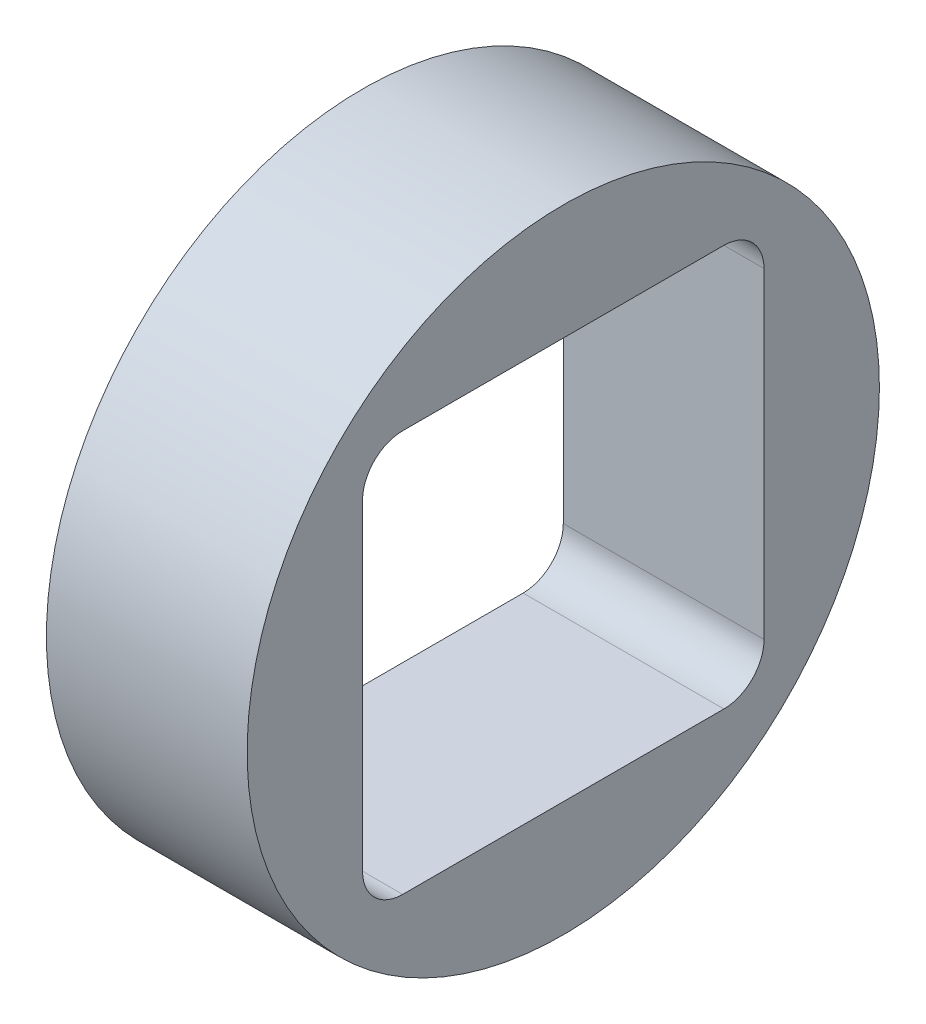
ISO-10303-21;
HEADER;
FILE_DESCRIPTION(('STEP AP214'),'2;1');
FILE_NAME('part.step','',(''),(''),'','','');
FILE_SCHEMA(('AUTOMOTIVE_DESIGN { 1 0 10303 214 1 1 1 1 }'));
ENDSEC;
DATA;
#1=APPLICATION_CONTEXT('core data for automotive mechanical design processes');
#2=APPLICATION_PROTOCOL_DEFINITION('international standard','automotive_design',2000,#1);
#3=PRODUCT_CONTEXT('',#1,'mechanical');
#4=PRODUCT('Part','Part','',(#3));
#5=PRODUCT_RELATED_PRODUCT_CATEGORY('part','',(#4));
#6=PRODUCT_DEFINITION_FORMATION('','',#4);
#7=PRODUCT_DEFINITION_CONTEXT('part definition',#1,'design');
#8=PRODUCT_DEFINITION('design','',#6,#7);
#9=PRODUCT_DEFINITION_SHAPE('','',#8);
#10=(LENGTH_UNIT() NAMED_UNIT(*) SI_UNIT(.MILLI.,.METRE.));
#11=(NAMED_UNIT(*) PLANE_ANGLE_UNIT() SI_UNIT($,.RADIAN.));
#12=(NAMED_UNIT(*) SI_UNIT($,.STERADIAN.) SOLID_ANGLE_UNIT());
#13=UNCERTAINTY_MEASURE_WITH_UNIT(LENGTH_MEASURE(1.E-05),#10,'distance_accuracy_value','');
#14=(GEOMETRIC_REPRESENTATION_CONTEXT(3) GLOBAL_UNCERTAINTY_ASSIGNED_CONTEXT((#13)) GLOBAL_UNIT_ASSIGNED_CONTEXT((#10,
#11,#12)) REPRESENTATION_CONTEXT('',''));
#15=CARTESIAN_POINT('',(0.,0.,0.));
#16=DIRECTION('',(0.,0.,1.));
#17=DIRECTION('',(1.,0.,0.));
#18=AXIS2_PLACEMENT_3D('',#15,#16,#17);
#19=CARTESIAN_POINT('',(3.175,0.,0.));
#20=DIRECTION('',(-1.,0.,0.));
#21=DIRECTION('',(0.,0.,1.));
#22=AXIS2_PLACEMENT_3D('',#19,#20,#21);
#23=CYLINDRICAL_SURFACE('',#22,5.);
#24=CARTESIAN_POINT('',(3.175,0.,0.));
#25=DIRECTION('',(1.,0.,0.));
#26=DIRECTION('',(0.,0.,-1.));
#27=AXIS2_PLACEMENT_3D('',#24,#25,#26);
#28=CIRCLE('',#27,5.);
#29=CARTESIAN_POINT('',(3.175,0.,-5.));
#30=VERTEX_POINT('',#29);
#31=EDGE_CURVE('E154',#30,#30,#28,.T.);
#32=ORIENTED_EDGE('',*,*,#31,.F.);
#33=EDGE_LOOP('',(#32));
#34=FACE_BOUND('',#33,.T.);
#35=CARTESIAN_POINT('',(0.,0.,0.));
#36=DIRECTION('',(1.,0.,0.));
#37=DIRECTION('',(0.,0.,-1.));
#38=AXIS2_PLACEMENT_3D('',#35,#36,#37);
#39=CIRCLE('',#38,5.);
#40=CARTESIAN_POINT('',(0.,0.,-5.));
#41=VERTEX_POINT('',#40);
#42=EDGE_CURVE('E157',#41,#41,#39,.T.);
#43=ORIENTED_EDGE('',*,*,#42,.T.);
#44=EDGE_LOOP('',(#43));
#45=FACE_BOUND('',#44,.T.);
#46=ADVANCED_FACE('F47',(#34,#45),#23,.T.);
#47=CARTESIAN_POINT('',(3.175,0.,0.));
#48=DIRECTION('',(1.,0.,0.));
#49=DIRECTION('',(0.,0.,-1.));
#50=AXIS2_PLACEMENT_3D('',#47,#48,#49);
#51=PLANE('',#50);
#52=DIRECTION('',(0.,1.,0.));
#53=VECTOR('',#52,1.);
#54=CARTESIAN_POINT('',(3.175,-3.175,-3.175));
#55=LINE('',#54,#53);
#56=CARTESIAN_POINT('',(3.175,-2.54,-3.175));
#57=VERTEX_POINT('',#56);
#58=CARTESIAN_POINT('',(3.175,2.54,-3.175));
#59=VERTEX_POINT('',#58);
#60=EDGE_CURVE('E147',#57,#59,#55,.T.);
#61=ORIENTED_EDGE('',*,*,#60,.F.);
#62=CARTESIAN_POINT('',(3.175,-2.54,-2.54));
#63=DIRECTION('',(1.,0.,0.));
#64=DIRECTION('',(0.,0.,-1.));
#65=AXIS2_PLACEMENT_3D('',#62,#63,#64);
#66=CIRCLE('',#65,0.635);
#67=CARTESIAN_POINT('',(3.175,-3.175,-2.54));
#68=VERTEX_POINT('',#67);
#69=EDGE_CURVE('E123',#57,#68,#66,.F.);
#70=ORIENTED_EDGE('',*,*,#69,.T.);
#71=DIRECTION('',(0.,0.,1.));
#72=VECTOR('',#71,1.);
#73=CARTESIAN_POINT('',(3.175,-3.175,-3.175));
#74=LINE('',#73,#72);
#75=CARTESIAN_POINT('',(3.175,-3.175,2.54));
#76=VERTEX_POINT('',#75);
#77=EDGE_CURVE('E133',#68,#76,#74,.T.);
#78=ORIENTED_EDGE('',*,*,#77,.T.);
#79=CARTESIAN_POINT('',(3.175,-2.54,2.54));
#80=DIRECTION('',(1.,0.,0.));
#81=DIRECTION('',(0.,0.,-1.));
#82=AXIS2_PLACEMENT_3D('',#79,#80,#81);
#83=CIRCLE('',#82,0.635);
#84=CARTESIAN_POINT('',(3.175,-2.54,3.175));
#85=VERTEX_POINT('',#84);
#86=EDGE_CURVE('E174',#76,#85,#83,.F.);
#87=ORIENTED_EDGE('',*,*,#86,.T.);
#88=DIRECTION('',(0.,1.,0.));
#89=VECTOR('',#88,1.);
#90=CARTESIAN_POINT('',(3.175,-3.175,3.175));
#91=LINE('',#90,#89);
#92=CARTESIAN_POINT('',(3.175,2.54,3.175));
#93=VERTEX_POINT('',#92);
#94=EDGE_CURVE('E190',#85,#93,#91,.T.);
#95=ORIENTED_EDGE('',*,*,#94,.T.);
#96=CARTESIAN_POINT('',(3.175,2.54,2.54));
#97=DIRECTION('',(1.,0.,0.));
#98=DIRECTION('',(0.,0.,-1.));
#99=AXIS2_PLACEMENT_3D('',#96,#97,#98);
#100=CIRCLE('',#99,0.635);
#101=CARTESIAN_POINT('',(3.175,3.175,2.54));
#102=VERTEX_POINT('',#101);
#103=EDGE_CURVE('E62',#93,#102,#100,.F.);
#104=ORIENTED_EDGE('',*,*,#103,.T.);
#105=DIRECTION('',(0.,0.,1.));
#106=VECTOR('',#105,1.);
#107=CARTESIAN_POINT('',(3.175,3.175,-3.175));
#108=LINE('',#107,#106);
#109=CARTESIAN_POINT('',(3.175,3.175,-2.54));
#110=VERTEX_POINT('',#109);
#111=EDGE_CURVE('E187',#110,#102,#108,.T.);
#112=ORIENTED_EDGE('',*,*,#111,.F.);
#113=CARTESIAN_POINT('',(3.175,2.54,-2.54));
#114=DIRECTION('',(1.,0.,0.));
#115=DIRECTION('',(0.,0.,-1.));
#116=AXIS2_PLACEMENT_3D('',#113,#114,#115);
#117=CIRCLE('',#116,0.635);
#118=EDGE_CURVE('E12',#110,#59,#117,.F.);
#119=ORIENTED_EDGE('',*,*,#118,.T.);
#120=EDGE_LOOP('',(#61,#70,#78,#87,#95,#104,#112,#119));
#121=FACE_BOUND('',#120,.T.);
#122=ORIENTED_EDGE('',*,*,#31,.T.);
#123=EDGE_LOOP('',(#122));
#124=FACE_BOUND('',#123,.T.);
#125=ADVANCED_FACE('F185',(#121,#124),#51,.T.);
#126=CARTESIAN_POINT('',(0.,0.,0.));
#127=DIRECTION('',(1.,0.,0.));
#128=DIRECTION('',(0.,0.,-1.));
#129=AXIS2_PLACEMENT_3D('',#126,#127,#128);
#130=PLANE('',#129);
#131=DIRECTION('',(0.,1.,0.));
#132=VECTOR('',#131,1.);
#133=CARTESIAN_POINT('',(0.,-3.175,3.175));
#134=LINE('',#133,#132);
#135=CARTESIAN_POINT('',(0.,-2.54,3.175));
#136=VERTEX_POINT('',#135);
#137=CARTESIAN_POINT('',(0.,2.54,3.175));
#138=VERTEX_POINT('',#137);
#139=EDGE_CURVE('E141',#136,#138,#134,.T.);
#140=ORIENTED_EDGE('',*,*,#139,.F.);
#141=CARTESIAN_POINT('',(0.,-2.54,2.54));
#142=DIRECTION('',(1.,0.,0.));
#143=DIRECTION('',(0.,0.,-1.));
#144=AXIS2_PLACEMENT_3D('',#141,#142,#143);
#145=CIRCLE('',#144,0.635);
#146=CARTESIAN_POINT('',(0.,-3.175,2.54));
#147=VERTEX_POINT('',#146);
#148=EDGE_CURVE('E140',#136,#147,#145,.T.);
#149=ORIENTED_EDGE('',*,*,#148,.T.);
#150=DIRECTION('',(0.,0.,1.));
#151=VECTOR('',#150,1.);
#152=CARTESIAN_POINT('',(0.,-3.175,-3.175));
#153=LINE('',#152,#151);
#154=CARTESIAN_POINT('',(0.,-3.175,-2.54));
#155=VERTEX_POINT('',#154);
#156=EDGE_CURVE('E130',#155,#147,#153,.T.);
#157=ORIENTED_EDGE('',*,*,#156,.F.);
#158=CARTESIAN_POINT('',(0.,-2.54,-2.54));
#159=DIRECTION('',(1.,0.,0.));
#160=DIRECTION('',(0.,0.,-1.));
#161=AXIS2_PLACEMENT_3D('',#158,#159,#160);
#162=CIRCLE('',#161,0.635);
#163=CARTESIAN_POINT('',(0.,-2.54,-3.175));
#164=VERTEX_POINT('',#163);
#165=EDGE_CURVE('E113',#155,#164,#162,.T.);
#166=ORIENTED_EDGE('',*,*,#165,.T.);
#167=DIRECTION('',(0.,1.,0.));
#168=VECTOR('',#167,1.);
#169=CARTESIAN_POINT('',(0.,-3.175,-3.175));
#170=LINE('',#169,#168);
#171=CARTESIAN_POINT('',(0.,2.54,-3.175));
#172=VERTEX_POINT('',#171);
#173=EDGE_CURVE('E152',#164,#172,#170,.T.);
#174=ORIENTED_EDGE('',*,*,#173,.T.);
#175=CARTESIAN_POINT('',(0.,2.54,-2.54));
#176=DIRECTION('',(1.,0.,0.));
#177=DIRECTION('',(0.,0.,-1.));
#178=AXIS2_PLACEMENT_3D('',#175,#176,#177);
#179=CIRCLE('',#178,0.635);
#180=CARTESIAN_POINT('',(0.,3.175,-2.54));
#181=VERTEX_POINT('',#180);
#182=EDGE_CURVE('E55',#172,#181,#179,.T.);
#183=ORIENTED_EDGE('',*,*,#182,.T.);
#184=DIRECTION('',(0.,0.,1.));
#185=VECTOR('',#184,1.);
#186=CARTESIAN_POINT('',(0.,3.175,-3.175));
#187=LINE('',#186,#185);
#188=CARTESIAN_POINT('',(0.,3.175,2.54));
#189=VERTEX_POINT('',#188);
#190=EDGE_CURVE('E144',#181,#189,#187,.T.);
#191=ORIENTED_EDGE('',*,*,#190,.T.);
#192=CARTESIAN_POINT('',(0.,2.54,2.54));
#193=DIRECTION('',(1.,0.,0.));
#194=DIRECTION('',(0.,0.,-1.));
#195=AXIS2_PLACEMENT_3D('',#192,#193,#194);
#196=CIRCLE('',#195,0.635);
#197=EDGE_CURVE('E176',#189,#138,#196,.T.);
#198=ORIENTED_EDGE('',*,*,#197,.T.);
#199=EDGE_LOOP('',(#140,#149,#157,#166,#174,#183,#191,#198));
#200=FACE_BOUND('',#199,.T.);
#201=ORIENTED_EDGE('',*,*,#42,.F.);
#202=EDGE_LOOP('',(#201));
#203=FACE_BOUND('',#202,.T.);
#204=ADVANCED_FACE('F138',(#200,#203),#130,.F.);
#205=CARTESIAN_POINT('',(3.175,-3.175,-3.175));
#206=DIRECTION('',(0.,-1.,0.));
#207=DIRECTION('',(0.,0.,-1.));
#208=AXIS2_PLACEMENT_3D('',#205,#206,#207);
#209=PLANE('',#208);
#210=ORIENTED_EDGE('',*,*,#77,.F.);
#211=DIRECTION('',(-1.,0.,0.));
#212=VECTOR('',#211,1.);
#213=CARTESIAN_POINT('',(3.175,-3.175,-2.54));
#214=LINE('',#213,#212);
#215=EDGE_CURVE('E117',#68,#155,#214,.T.);
#216=ORIENTED_EDGE('',*,*,#215,.T.);
#217=ORIENTED_EDGE('',*,*,#156,.T.);
#218=DIRECTION('',(-1.,0.,0.));
#219=VECTOR('',#218,1.);
#220=CARTESIAN_POINT('',(3.175,-3.175,2.54));
#221=LINE('',#220,#219);
#222=EDGE_CURVE('E135',#147,#76,#221,.F.);
#223=ORIENTED_EDGE('',*,*,#222,.T.);
#224=EDGE_LOOP('',(#210,#216,#217,#223));
#225=FACE_BOUND('',#224,.T.);
#226=ADVANCED_FACE('F129',(#225),#209,.F.);
#227=CARTESIAN_POINT('',(3.175,-3.175,-3.175));
#228=DIRECTION('',(0.,0.,1.));
#229=DIRECTION('',(1.,0.,0.));
#230=AXIS2_PLACEMENT_3D('',#227,#228,#229);
#231=PLANE('',#230);
#232=ORIENTED_EDGE('',*,*,#173,.F.);
#233=DIRECTION('',(-1.,0.,0.));
#234=VECTOR('',#233,1.);
#235=CARTESIAN_POINT('',(3.175,-2.54,-3.175));
#236=LINE('',#235,#234);
#237=EDGE_CURVE('E118',#164,#57,#236,.F.);
#238=ORIENTED_EDGE('',*,*,#237,.T.);
#239=ORIENTED_EDGE('',*,*,#60,.T.);
#240=DIRECTION('',(-1.,0.,0.));
#241=VECTOR('',#240,1.);
#242=CARTESIAN_POINT('',(0.,2.54,-3.175));
#243=LINE('',#242,#241);
#244=EDGE_CURVE('E134',#59,#172,#243,.T.);
#245=ORIENTED_EDGE('',*,*,#244,.T.);
#246=EDGE_LOOP('',(#232,#238,#239,#245));
#247=FACE_BOUND('',#246,.T.);
#248=ADVANCED_FACE('F189',(#247),#231,.T.);
#249=CARTESIAN_POINT('',(3.175,3.175,-3.175));
#250=DIRECTION('',(0.,-1.,0.));
#251=DIRECTION('',(0.,0.,-1.));
#252=AXIS2_PLACEMENT_3D('',#249,#250,#251);
#253=PLANE('',#252);
#254=ORIENTED_EDGE('',*,*,#111,.T.);
#255=DIRECTION('',(-1.,0.,0.));
#256=VECTOR('',#255,1.);
#257=CARTESIAN_POINT('',(3.175,3.175,2.54));
#258=LINE('',#257,#256);
#259=EDGE_CURVE('E124',#102,#189,#258,.T.);
#260=ORIENTED_EDGE('',*,*,#259,.T.);
#261=ORIENTED_EDGE('',*,*,#190,.F.);
#262=DIRECTION('',(-1.,0.,0.));
#263=VECTOR('',#262,1.);
#264=CARTESIAN_POINT('',(3.175,3.175,-2.54));
#265=LINE('',#264,#263);
#266=EDGE_CURVE('E69',#181,#110,#265,.F.);
#267=ORIENTED_EDGE('',*,*,#266,.T.);
#268=EDGE_LOOP('',(#254,#260,#261,#267));
#269=FACE_BOUND('',#268,.T.);
#270=ADVANCED_FACE('F180',(#269),#253,.T.);
#271=CARTESIAN_POINT('',(3.175,-3.175,3.175));
#272=DIRECTION('',(0.,0.,1.));
#273=DIRECTION('',(1.,0.,0.));
#274=AXIS2_PLACEMENT_3D('',#271,#272,#273);
#275=PLANE('',#274);
#276=ORIENTED_EDGE('',*,*,#94,.F.);
#277=DIRECTION('',(-1.,0.,0.));
#278=VECTOR('',#277,1.);
#279=CARTESIAN_POINT('',(0.,-2.54,3.175));
#280=LINE('',#279,#278);
#281=EDGE_CURVE('E166',#85,#136,#280,.T.);
#282=ORIENTED_EDGE('',*,*,#281,.T.);
#283=ORIENTED_EDGE('',*,*,#139,.T.);
#284=DIRECTION('',(-1.,0.,0.));
#285=VECTOR('',#284,1.);
#286=CARTESIAN_POINT('',(3.175,2.54,3.175));
#287=LINE('',#286,#285);
#288=EDGE_CURVE('E164',#138,#93,#287,.F.);
#289=ORIENTED_EDGE('',*,*,#288,.T.);
#290=EDGE_LOOP('',(#276,#282,#283,#289));
#291=FACE_BOUND('',#290,.T.);
#292=ADVANCED_FACE('F199',(#291),#275,.F.);
#293=CARTESIAN_POINT('',(3.175,-2.54,-2.54));
#294=DIRECTION('',(-1.,0.,0.));
#295=DIRECTION('',(0.,0.,1.));
#296=AXIS2_PLACEMENT_3D('',#293,#294,#295);
#297=CYLINDRICAL_SURFACE('',#296,0.635);
#298=ORIENTED_EDGE('',*,*,#69,.F.);
#299=ORIENTED_EDGE('',*,*,#237,.F.);
#300=ORIENTED_EDGE('',*,*,#165,.F.);
#301=ORIENTED_EDGE('',*,*,#215,.F.);
#302=EDGE_LOOP('',(#298,#299,#300,#301));
#303=FACE_BOUND('',#302,.T.);
#304=ADVANCED_FACE('F116',(#303),#297,.F.);
#305=CARTESIAN_POINT('',(3.175,-2.54,2.54));
#306=DIRECTION('',(1.,0.,0.));
#307=DIRECTION('',(0.,0.,-1.));
#308=AXIS2_PLACEMENT_3D('',#305,#306,#307);
#309=CYLINDRICAL_SURFACE('',#308,0.635);
#310=ORIENTED_EDGE('',*,*,#86,.F.);
#311=ORIENTED_EDGE('',*,*,#222,.F.);
#312=ORIENTED_EDGE('',*,*,#148,.F.);
#313=ORIENTED_EDGE('',*,*,#281,.F.);
#314=EDGE_LOOP('',(#310,#311,#312,#313));
#315=FACE_BOUND('',#314,.T.);
#316=ADVANCED_FACE('F197',(#315),#309,.F.);
#317=CARTESIAN_POINT('',(3.175,2.54,2.54));
#318=DIRECTION('',(-1.,0.,0.));
#319=DIRECTION('',(0.,0.,1.));
#320=AXIS2_PLACEMENT_3D('',#317,#318,#319);
#321=CYLINDRICAL_SURFACE('',#320,0.635);
#322=ORIENTED_EDGE('',*,*,#103,.F.);
#323=ORIENTED_EDGE('',*,*,#288,.F.);
#324=ORIENTED_EDGE('',*,*,#197,.F.);
#325=ORIENTED_EDGE('',*,*,#259,.F.);
#326=EDGE_LOOP('',(#322,#323,#324,#325));
#327=FACE_BOUND('',#326,.T.);
#328=ADVANCED_FACE('F202',(#327),#321,.F.);
#329=CARTESIAN_POINT('',(3.175,2.54,-2.54));
#330=DIRECTION('',(1.,0.,0.));
#331=DIRECTION('',(0.,0.,-1.));
#332=AXIS2_PLACEMENT_3D('',#329,#330,#331);
#333=CYLINDRICAL_SURFACE('',#332,0.635);
#334=ORIENTED_EDGE('',*,*,#118,.F.);
#335=ORIENTED_EDGE('',*,*,#266,.F.);
#336=ORIENTED_EDGE('',*,*,#182,.F.);
#337=ORIENTED_EDGE('',*,*,#244,.F.);
#338=EDGE_LOOP('',(#334,#335,#336,#337));
#339=FACE_BOUND('',#338,.T.);
#340=ADVANCED_FACE('F49',(#339),#333,.F.);
#341=CLOSED_SHELL('',(#46,#125,#204,#226,#248,#270,#292,#304,#316,#328,#340));
#342=MANIFOLD_SOLID_BREP('B2',#341);
#343=ADVANCED_BREP_SHAPE_REPRESENTATION('',(#18,#342),#14);
#344=SHAPE_DEFINITION_REPRESENTATION(#9,#343);
ENDSEC;
END-ISO-10303-21;
